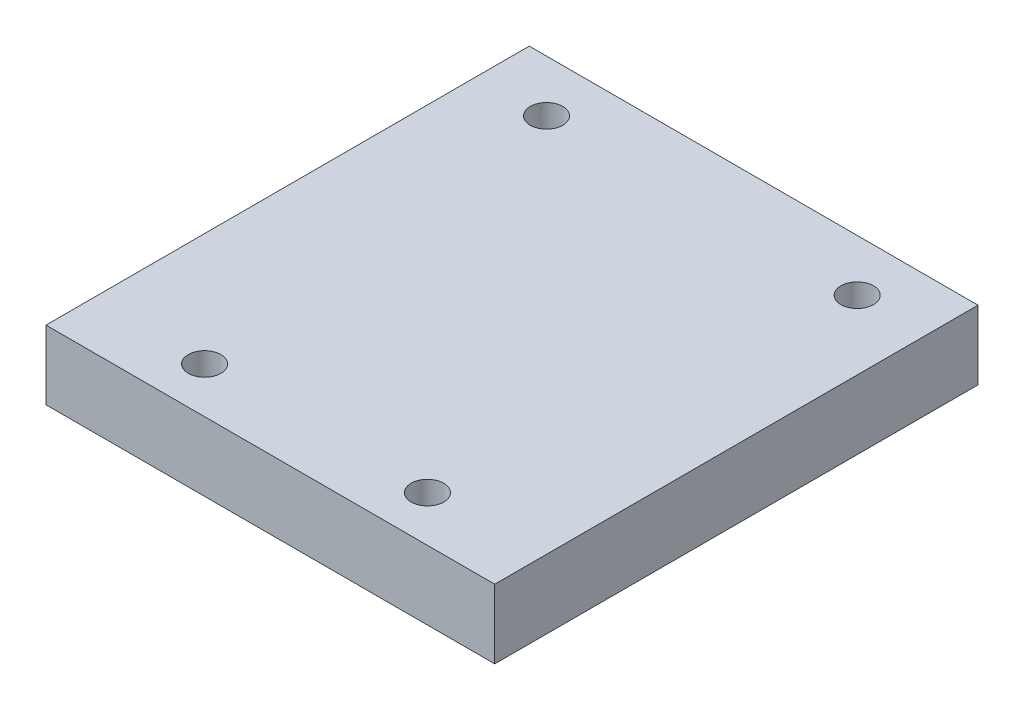
ISO-10303-21;
HEADER;
FILE_DESCRIPTION(('STEP AP214'),'2;1');
FILE_NAME('part.step','',(''),(''),'','','');
FILE_SCHEMA(('AUTOMOTIVE_DESIGN { 1 0 10303 214 1 1 1 1 }'));
ENDSEC;
DATA;
#1=APPLICATION_CONTEXT('core data for automotive mechanical design processes');
#2=APPLICATION_PROTOCOL_DEFINITION('international standard','automotive_design',2000,#1);
#3=PRODUCT_CONTEXT('',#1,'mechanical');
#4=PRODUCT('Part','Part','',(#3));
#5=PRODUCT_RELATED_PRODUCT_CATEGORY('part','',(#4));
#6=PRODUCT_DEFINITION_FORMATION('','',#4);
#7=PRODUCT_DEFINITION_CONTEXT('part definition',#1,'design');
#8=PRODUCT_DEFINITION('design','',#6,#7);
#9=PRODUCT_DEFINITION_SHAPE('','',#8);
#10=(LENGTH_UNIT() NAMED_UNIT(*) SI_UNIT(.MILLI.,.METRE.));
#11=(NAMED_UNIT(*) PLANE_ANGLE_UNIT() SI_UNIT($,.RADIAN.));
#12=(NAMED_UNIT(*) SI_UNIT($,.STERADIAN.) SOLID_ANGLE_UNIT());
#13=UNCERTAINTY_MEASURE_WITH_UNIT(LENGTH_MEASURE(1.E-05),#10,'distance_accuracy_value','');
#14=(GEOMETRIC_REPRESENTATION_CONTEXT(3) GLOBAL_UNCERTAINTY_ASSIGNED_CONTEXT((#13)) GLOBAL_UNIT_ASSIGNED_CONTEXT((#10,
#11,#12)) REPRESENTATION_CONTEXT('',''));
#15=CARTESIAN_POINT('',(0.,0.,0.));
#16=DIRECTION('',(0.,0.,1.));
#17=DIRECTION('',(1.,0.,0.));
#18=AXIS2_PLACEMENT_3D('',#15,#16,#17);
#19=CARTESIAN_POINT('',(0.,12.7,0.));
#20=DIRECTION('',(-1.,0.,0.));
#21=DIRECTION('',(0.,0.,1.));
#22=AXIS2_PLACEMENT_3D('',#19,#20,#21);
#23=PLANE('',#22);
#24=DIRECTION('',(0.,0.,-1.));
#25=VECTOR('',#24,1.);
#26=CARTESIAN_POINT('',(0.,0.,0.));
#27=LINE('',#26,#25);
#28=CARTESIAN_POINT('',(0.,0.,88.9));
#29=VERTEX_POINT('',#28);
#30=CARTESIAN_POINT('',(0.,0.,0.));
#31=VERTEX_POINT('',#30);
#32=EDGE_CURVE('E113',#29,#31,#27,.T.);
#33=ORIENTED_EDGE('',*,*,#32,.T.);
#34=DIRECTION('',(0.,-1.,0.));
#35=VECTOR('',#34,1.);
#36=CARTESIAN_POINT('',(0.,12.7,0.));
#37=LINE('',#36,#35);
#38=CARTESIAN_POINT('',(0.,12.7,0.));
#39=VERTEX_POINT('',#38);
#40=EDGE_CURVE('E11',#39,#31,#37,.T.);
#41=ORIENTED_EDGE('',*,*,#40,.F.);
#42=DIRECTION('',(0.,0.,-1.));
#43=VECTOR('',#42,1.);
#44=CARTESIAN_POINT('',(0.,12.7,0.));
#45=LINE('',#44,#43);
#46=CARTESIAN_POINT('',(0.,12.7,88.9));
#47=VERTEX_POINT('',#46);
#48=EDGE_CURVE('E97',#47,#39,#45,.T.);
#49=ORIENTED_EDGE('',*,*,#48,.F.);
#50=DIRECTION('',(0.,-1.,0.));
#51=VECTOR('',#50,1.);
#52=CARTESIAN_POINT('',(0.,12.7,88.9));
#53=LINE('',#52,#51);
#54=EDGE_CURVE('E109',#47,#29,#53,.T.);
#55=ORIENTED_EDGE('',*,*,#54,.T.);
#56=EDGE_LOOP('',(#33,#41,#49,#55));
#57=FACE_BOUND('',#56,.T.);
#58=ADVANCED_FACE('F45',(#57),#23,.F.);
#59=CARTESIAN_POINT('',(0.,12.7,0.));
#60=DIRECTION('',(0.,0.,1.));
#61=DIRECTION('',(1.,0.,0.));
#62=AXIS2_PLACEMENT_3D('',#59,#60,#61);
#63=PLANE('',#62);
#64=DIRECTION('',(-1.,0.,0.));
#65=VECTOR('',#64,1.);
#66=CARTESIAN_POINT('',(0.,0.,0.));
#67=LINE('',#66,#65);
#68=CARTESIAN_POINT('',(-82.55,0.,0.));
#69=VERTEX_POINT('',#68);
#70=EDGE_CURVE('E102',#31,#69,#67,.T.);
#71=ORIENTED_EDGE('',*,*,#70,.T.);
#72=DIRECTION('',(0.,-1.,0.));
#73=VECTOR('',#72,1.);
#74=CARTESIAN_POINT('',(-82.55,12.7,0.));
#75=LINE('',#74,#73);
#76=CARTESIAN_POINT('',(-82.55,12.7,0.));
#77=VERTEX_POINT('',#76);
#78=EDGE_CURVE('E54',#77,#69,#75,.T.);
#79=ORIENTED_EDGE('',*,*,#78,.F.);
#80=DIRECTION('',(-1.,0.,0.));
#81=VECTOR('',#80,1.);
#82=CARTESIAN_POINT('',(0.,12.7,0.));
#83=LINE('',#82,#81);
#84=EDGE_CURVE('E92',#39,#77,#83,.T.);
#85=ORIENTED_EDGE('',*,*,#84,.F.);
#86=ORIENTED_EDGE('',*,*,#40,.T.);
#87=EDGE_LOOP('',(#71,#79,#85,#86));
#88=FACE_BOUND('',#87,.T.);
#89=ADVANCED_FACE('F101',(#88),#63,.F.);
#90=CARTESIAN_POINT('',(-82.55,12.7,0.));
#91=DIRECTION('',(1.,0.,0.));
#92=DIRECTION('',(0.,0.,-1.));
#93=AXIS2_PLACEMENT_3D('',#90,#91,#92);
#94=PLANE('',#93);
#95=DIRECTION('',(0.,0.,1.));
#96=VECTOR('',#95,1.);
#97=CARTESIAN_POINT('',(-82.55,0.,0.));
#98=LINE('',#97,#96);
#99=CARTESIAN_POINT('',(-82.55,0.,88.9));
#100=VERTEX_POINT('',#99);
#101=EDGE_CURVE('E79',#69,#100,#98,.T.);
#102=ORIENTED_EDGE('',*,*,#101,.T.);
#103=DIRECTION('',(0.,-1.,0.));
#104=VECTOR('',#103,1.);
#105=CARTESIAN_POINT('',(-82.55,12.7,88.9));
#106=LINE('',#105,#104);
#107=CARTESIAN_POINT('',(-82.55,12.7,88.9));
#108=VERTEX_POINT('',#107);
#109=EDGE_CURVE('E104',#108,#100,#106,.T.);
#110=ORIENTED_EDGE('',*,*,#109,.F.);
#111=DIRECTION('',(0.,0.,1.));
#112=VECTOR('',#111,1.);
#113=CARTESIAN_POINT('',(-82.55,12.7,0.));
#114=LINE('',#113,#112);
#115=EDGE_CURVE('E95',#77,#108,#114,.T.);
#116=ORIENTED_EDGE('',*,*,#115,.F.);
#117=ORIENTED_EDGE('',*,*,#78,.T.);
#118=EDGE_LOOP('',(#102,#110,#116,#117));
#119=FACE_BOUND('',#118,.T.);
#120=ADVANCED_FACE('F105',(#119),#94,.F.);
#121=CARTESIAN_POINT('',(0.,12.7,88.9));
#122=DIRECTION('',(0.,0.,-1.));
#123=DIRECTION('',(-1.,0.,0.));
#124=AXIS2_PLACEMENT_3D('',#121,#122,#123);
#125=PLANE('',#124);
#126=DIRECTION('',(1.,0.,0.));
#127=VECTOR('',#126,1.);
#128=CARTESIAN_POINT('',(0.,0.,88.9));
#129=LINE('',#128,#127);
#130=EDGE_CURVE('E85',#100,#29,#129,.T.);
#131=ORIENTED_EDGE('',*,*,#130,.T.);
#132=ORIENTED_EDGE('',*,*,#54,.F.);
#133=DIRECTION('',(1.,0.,0.));
#134=VECTOR('',#133,1.);
#135=CARTESIAN_POINT('',(0.,12.7,88.9));
#136=LINE('',#135,#134);
#137=EDGE_CURVE('E62',#108,#47,#136,.T.);
#138=ORIENTED_EDGE('',*,*,#137,.F.);
#139=ORIENTED_EDGE('',*,*,#109,.T.);
#140=EDGE_LOOP('',(#131,#132,#138,#139));
#141=FACE_BOUND('',#140,.T.);
#142=ADVANCED_FACE('F127',(#141),#125,.F.);
#143=CARTESIAN_POINT('',(0.,12.7,0.));
#144=DIRECTION('',(0.,-1.,0.));
#145=DIRECTION('',(0.,0.,-1.));
#146=AXIS2_PLACEMENT_3D('',#143,#144,#145);
#147=PLANE('',#146);
#148=CARTESIAN_POINT('',(-69.85,12.7,9.525));
#149=DIRECTION('',(0.,1.,0.));
#150=DIRECTION('',(0.,0.,1.));
#151=AXIS2_PLACEMENT_3D('',#148,#149,#150);
#152=CIRCLE('',#151,3.00000000000001);
#153=CARTESIAN_POINT('',(-69.85,12.7,12.525));
#154=VERTEX_POINT('',#153);
#155=EDGE_CURVE('E151',#154,#154,#152,.T.);
#156=ORIENTED_EDGE('',*,*,#155,.F.);
#157=EDGE_LOOP('',(#156));
#158=FACE_BOUND('',#157,.T.);
#159=CARTESIAN_POINT('',(-20.775,12.7,80.5046504728644));
#160=DIRECTION('',(0.,1.,0.));
#161=DIRECTION('',(0.,0.,1.));
#162=AXIS2_PLACEMENT_3D('',#159,#160,#161);
#163=CIRCLE('',#162,3.);
#164=CARTESIAN_POINT('',(-20.775,12.7,83.5046504728644));
#165=VERTEX_POINT('',#164);
#166=EDGE_CURVE('E139',#165,#165,#163,.T.);
#167=ORIENTED_EDGE('',*,*,#166,.F.);
#168=EDGE_LOOP('',(#167));
#169=FACE_BOUND('',#168,.T.);
#170=CARTESIAN_POINT('',(-61.775,12.7,80.5046504728644));
#171=DIRECTION('',(0.,1.,0.));
#172=DIRECTION('',(0.,0.,1.));
#173=AXIS2_PLACEMENT_3D('',#170,#171,#172);
#174=CIRCLE('',#173,3.00000000000001);
#175=CARTESIAN_POINT('',(-61.775,12.7,83.5046504728644));
#176=VERTEX_POINT('',#175);
#177=EDGE_CURVE('E138',#176,#176,#174,.T.);
#178=ORIENTED_EDGE('',*,*,#177,.F.);
#179=EDGE_LOOP('',(#178));
#180=FACE_BOUND('',#179,.T.);
#181=CARTESIAN_POINT('',(-12.7,12.7,9.525));
#182=DIRECTION('',(0.,1.,0.));
#183=DIRECTION('',(0.,0.,1.));
#184=AXIS2_PLACEMENT_3D('',#181,#182,#183);
#185=CIRCLE('',#184,3.);
#186=CARTESIAN_POINT('',(-12.7,12.7,12.525));
#187=VERTEX_POINT('',#186);
#188=EDGE_CURVE('E147',#187,#187,#185,.T.);
#189=ORIENTED_EDGE('',*,*,#188,.F.);
#190=EDGE_LOOP('',(#189));
#191=FACE_BOUND('',#190,.T.);
#192=ORIENTED_EDGE('',*,*,#48,.T.);
#193=ORIENTED_EDGE('',*,*,#84,.T.);
#194=ORIENTED_EDGE('',*,*,#115,.T.);
#195=ORIENTED_EDGE('',*,*,#137,.T.);
#196=EDGE_LOOP('',(#192,#193,#194,#195));
#197=FACE_BOUND('',#196,.T.);
#198=ADVANCED_FACE('F93',(#158,#169,#180,#191,#197),#147,.F.);
#199=CARTESIAN_POINT('',(0.,0.,0.));
#200=DIRECTION('',(0.,-1.,0.));
#201=DIRECTION('',(0.,0.,-1.));
#202=AXIS2_PLACEMENT_3D('',#199,#200,#201);
#203=PLANE('',#202);
#204=CARTESIAN_POINT('',(-34.8,0.,57.15));
#205=DIRECTION('',(0.,-1.,0.));
#206=DIRECTION('',(0.,0.,-1.));
#207=AXIS2_PLACEMENT_3D('',#204,#205,#206);
#208=CIRCLE('',#207,2.75);
#209=CARTESIAN_POINT('',(-34.8,0.,54.4));
#210=VERTEX_POINT('',#209);
#211=EDGE_CURVE('E170',#210,#210,#208,.T.);
#212=ORIENTED_EDGE('',*,*,#211,.F.);
#213=EDGE_LOOP('',(#212));
#214=FACE_BOUND('',#213,.T.);
#215=CARTESIAN_POINT('',(-50.8,0.,41.15));
#216=DIRECTION('',(0.,-1.,0.));
#217=DIRECTION('',(0.,0.,-1.));
#218=AXIS2_PLACEMENT_3D('',#215,#216,#217);
#219=CIRCLE('',#218,2.75);
#220=CARTESIAN_POINT('',(-50.8,0.,38.4));
#221=VERTEX_POINT('',#220);
#222=EDGE_CURVE('E178',#221,#221,#219,.T.);
#223=ORIENTED_EDGE('',*,*,#222,.F.);
#224=EDGE_LOOP('',(#223));
#225=FACE_BOUND('',#224,.T.);
#226=CARTESIAN_POINT('',(-34.8,0.,41.15));
#227=DIRECTION('',(0.,-1.,0.));
#228=DIRECTION('',(0.,0.,-1.));
#229=AXIS2_PLACEMENT_3D('',#226,#227,#228);
#230=CIRCLE('',#229,2.75);
#231=CARTESIAN_POINT('',(-34.8,0.,38.4));
#232=VERTEX_POINT('',#231);
#233=EDGE_CURVE('E179',#232,#232,#230,.T.);
#234=ORIENTED_EDGE('',*,*,#233,.F.);
#235=EDGE_LOOP('',(#234));
#236=FACE_BOUND('',#235,.T.);
#237=CARTESIAN_POINT('',(-50.8,0.,57.15));
#238=DIRECTION('',(0.,-1.,0.));
#239=DIRECTION('',(0.,0.,-1.));
#240=AXIS2_PLACEMENT_3D('',#237,#238,#239);
#241=CIRCLE('',#240,2.75);
#242=CARTESIAN_POINT('',(-50.8,0.,54.4));
#243=VERTEX_POINT('',#242);
#244=EDGE_CURVE('E166',#243,#243,#241,.T.);
#245=ORIENTED_EDGE('',*,*,#244,.F.);
#246=EDGE_LOOP('',(#245));
#247=FACE_BOUND('',#246,.T.);
#248=ORIENTED_EDGE('',*,*,#32,.F.);
#249=ORIENTED_EDGE('',*,*,#130,.F.);
#250=ORIENTED_EDGE('',*,*,#101,.F.);
#251=ORIENTED_EDGE('',*,*,#70,.F.);
#252=EDGE_LOOP('',(#248,#249,#250,#251));
#253=FACE_BOUND('',#252,.T.);
#254=ADVANCED_FACE('F130',(#214,#225,#236,#247,#253),#203,.T.);
#255=CARTESIAN_POINT('',(-12.7,6.35,9.525));
#256=DIRECTION('',(0.,1.,0.));
#257=DIRECTION('',(0.,0.,1.));
#258=AXIS2_PLACEMENT_3D('',#255,#256,#257);
#259=CYLINDRICAL_SURFACE('',#258,3.);
#260=CARTESIAN_POINT('',(-12.7,6.35,9.525));
#261=DIRECTION('',(0.,1.,0.));
#262=DIRECTION('',(0.,0.,1.));
#263=AXIS2_PLACEMENT_3D('',#260,#261,#262);
#264=CIRCLE('',#263,3.);
#265=CARTESIAN_POINT('',(-12.7,6.35,12.525));
#266=VERTEX_POINT('',#265);
#267=EDGE_CURVE('E143',#266,#266,#264,.T.);
#268=ORIENTED_EDGE('',*,*,#267,.F.);
#269=EDGE_LOOP('',(#268));
#270=FACE_BOUND('',#269,.T.);
#271=ORIENTED_EDGE('',*,*,#188,.T.);
#272=EDGE_LOOP('',(#271));
#273=FACE_BOUND('',#272,.T.);
#274=ADVANCED_FACE('F202',(#270,#273),#259,.F.);
#275=CARTESIAN_POINT('',(-12.7,6.35,9.525));
#276=DIRECTION('',(0.,1.,0.));
#277=DIRECTION('',(0.,0.,1.));
#278=AXIS2_PLACEMENT_3D('',#275,#276,#277);
#279=PLANE('',#278);
#280=ORIENTED_EDGE('',*,*,#267,.T.);
#281=EDGE_LOOP('',(#280));
#282=FACE_BOUND('',#281,.T.);
#283=ADVANCED_FACE('F245',(#282),#279,.T.);
#284=CARTESIAN_POINT('',(-61.775,6.35,80.5046504728644));
#285=DIRECTION('',(0.,1.,0.));
#286=DIRECTION('',(0.,0.,1.));
#287=AXIS2_PLACEMENT_3D('',#284,#285,#286);
#288=CYLINDRICAL_SURFACE('',#287,3.00000000000001);
#289=CARTESIAN_POINT('',(-61.775,6.35,80.5046504728644));
#290=DIRECTION('',(0.,1.,0.));
#291=DIRECTION('',(0.,0.,1.));
#292=AXIS2_PLACEMENT_3D('',#289,#290,#291);
#293=CIRCLE('',#292,3.00000000000001);
#294=CARTESIAN_POINT('',(-61.775,6.35,83.5046504728644));
#295=VERTEX_POINT('',#294);
#296=EDGE_CURVE('E134',#295,#295,#293,.T.);
#297=ORIENTED_EDGE('',*,*,#296,.F.);
#298=EDGE_LOOP('',(#297));
#299=FACE_BOUND('',#298,.T.);
#300=ORIENTED_EDGE('',*,*,#177,.T.);
#301=EDGE_LOOP('',(#300));
#302=FACE_BOUND('',#301,.T.);
#303=ADVANCED_FACE('F241',(#299,#302),#288,.F.);
#304=CARTESIAN_POINT('',(-61.775,6.35,80.5046504728644));
#305=DIRECTION('',(0.,1.,0.));
#306=DIRECTION('',(0.,0.,1.));
#307=AXIS2_PLACEMENT_3D('',#304,#305,#306);
#308=PLANE('',#307);
#309=ORIENTED_EDGE('',*,*,#296,.T.);
#310=EDGE_LOOP('',(#309));
#311=FACE_BOUND('',#310,.T.);
#312=ADVANCED_FACE('F237',(#311),#308,.T.);
#313=CARTESIAN_POINT('',(-20.775,6.35,80.5046504728644));
#314=DIRECTION('',(0.,1.,0.));
#315=DIRECTION('',(0.,0.,1.));
#316=AXIS2_PLACEMENT_3D('',#313,#314,#315);
#317=CYLINDRICAL_SURFACE('',#316,3.);
#318=CARTESIAN_POINT('',(-20.775,6.35,80.5046504728644));
#319=DIRECTION('',(0.,1.,0.));
#320=DIRECTION('',(0.,0.,1.));
#321=AXIS2_PLACEMENT_3D('',#318,#319,#320);
#322=CIRCLE('',#321,3.);
#323=CARTESIAN_POINT('',(-20.775,6.35,83.5046504728644));
#324=VERTEX_POINT('',#323);
#325=EDGE_CURVE('E152',#324,#324,#322,.T.);
#326=ORIENTED_EDGE('',*,*,#325,.F.);
#327=EDGE_LOOP('',(#326));
#328=FACE_BOUND('',#327,.T.);
#329=ORIENTED_EDGE('',*,*,#166,.T.);
#330=EDGE_LOOP('',(#329));
#331=FACE_BOUND('',#330,.T.);
#332=ADVANCED_FACE('F240',(#328,#331),#317,.F.);
#333=CARTESIAN_POINT('',(-20.775,6.35,80.5046504728644));
#334=DIRECTION('',(0.,1.,0.));
#335=DIRECTION('',(0.,0.,1.));
#336=AXIS2_PLACEMENT_3D('',#333,#334,#335);
#337=PLANE('',#336);
#338=ORIENTED_EDGE('',*,*,#325,.T.);
#339=EDGE_LOOP('',(#338));
#340=FACE_BOUND('',#339,.T.);
#341=ADVANCED_FACE('F253',(#340),#337,.T.);
#342=CARTESIAN_POINT('',(-69.85,6.35,9.525));
#343=DIRECTION('',(0.,1.,0.));
#344=DIRECTION('',(0.,0.,1.));
#345=AXIS2_PLACEMENT_3D('',#342,#343,#344);
#346=CYLINDRICAL_SURFACE('',#345,3.00000000000001);
#347=CARTESIAN_POINT('',(-69.85,6.35,9.525));
#348=DIRECTION('',(0.,1.,0.));
#349=DIRECTION('',(0.,0.,1.));
#350=AXIS2_PLACEMENT_3D('',#347,#348,#349);
#351=CIRCLE('',#350,3.00000000000001);
#352=CARTESIAN_POINT('',(-69.85,6.35,12.525));
#353=VERTEX_POINT('',#352);
#354=EDGE_CURVE('E117',#353,#353,#351,.T.);
#355=ORIENTED_EDGE('',*,*,#354,.F.);
#356=EDGE_LOOP('',(#355));
#357=FACE_BOUND('',#356,.T.);
#358=ORIENTED_EDGE('',*,*,#155,.T.);
#359=EDGE_LOOP('',(#358));
#360=FACE_BOUND('',#359,.T.);
#361=ADVANCED_FACE('F219',(#357,#360),#346,.F.);
#362=CARTESIAN_POINT('',(-69.85,6.35,9.525));
#363=DIRECTION('',(0.,1.,0.));
#364=DIRECTION('',(0.,0.,1.));
#365=AXIS2_PLACEMENT_3D('',#362,#363,#364);
#366=PLANE('',#365);
#367=ORIENTED_EDGE('',*,*,#354,.T.);
#368=EDGE_LOOP('',(#367));
#369=FACE_BOUND('',#368,.T.);
#370=ADVANCED_FACE('F210',(#369),#366,.T.);
#371=CARTESIAN_POINT('',(-50.8,6.35,57.15));
#372=DIRECTION('',(0.,-1.,0.));
#373=DIRECTION('',(0.,0.,-1.));
#374=AXIS2_PLACEMENT_3D('',#371,#372,#373);
#375=CYLINDRICAL_SURFACE('',#374,2.75);
#376=CARTESIAN_POINT('',(-50.8,6.35,57.15));
#377=DIRECTION('',(0.,-1.,0.));
#378=DIRECTION('',(0.,0.,-1.));
#379=AXIS2_PLACEMENT_3D('',#376,#377,#378);
#380=CIRCLE('',#379,2.75);
#381=CARTESIAN_POINT('',(-50.8,6.35,54.4));
#382=VERTEX_POINT('',#381);
#383=EDGE_CURVE('E156',#382,#382,#380,.T.);
#384=ORIENTED_EDGE('',*,*,#383,.F.);
#385=EDGE_LOOP('',(#384));
#386=FACE_BOUND('',#385,.T.);
#387=ORIENTED_EDGE('',*,*,#244,.T.);
#388=EDGE_LOOP('',(#387));
#389=FACE_BOUND('',#388,.T.);
#390=ADVANCED_FACE('F207',(#386,#389),#375,.F.);
#391=CARTESIAN_POINT('',(-50.8,6.35,57.15));
#392=DIRECTION('',(0.,-1.,0.));
#393=DIRECTION('',(0.,0.,-1.));
#394=AXIS2_PLACEMENT_3D('',#391,#392,#393);
#395=PLANE('',#394);
#396=ORIENTED_EDGE('',*,*,#383,.T.);
#397=EDGE_LOOP('',(#396));
#398=FACE_BOUND('',#397,.T.);
#399=ADVANCED_FACE('F209',(#398),#395,.T.);
#400=CARTESIAN_POINT('',(-34.8,6.35,41.15));
#401=DIRECTION('',(0.,-1.,0.));
#402=DIRECTION('',(0.,0.,-1.));
#403=AXIS2_PLACEMENT_3D('',#400,#401,#402);
#404=CYLINDRICAL_SURFACE('',#403,2.75);
#405=CARTESIAN_POINT('',(-34.8,6.35,41.15));
#406=DIRECTION('',(0.,-1.,0.));
#407=DIRECTION('',(0.,0.,-1.));
#408=AXIS2_PLACEMENT_3D('',#405,#406,#407);
#409=CIRCLE('',#408,2.75);
#410=CARTESIAN_POINT('',(-34.8,6.35,38.4));
#411=VERTEX_POINT('',#410);
#412=EDGE_CURVE('E190',#411,#411,#409,.T.);
#413=ORIENTED_EDGE('',*,*,#412,.F.);
#414=EDGE_LOOP('',(#413));
#415=FACE_BOUND('',#414,.T.);
#416=ORIENTED_EDGE('',*,*,#233,.T.);
#417=EDGE_LOOP('',(#416));
#418=FACE_BOUND('',#417,.T.);
#419=ADVANCED_FACE('F198',(#415,#418),#404,.F.);
#420=CARTESIAN_POINT('',(-34.8,6.35,41.15));
#421=DIRECTION('',(0.,-1.,0.));
#422=DIRECTION('',(0.,0.,-1.));
#423=AXIS2_PLACEMENT_3D('',#420,#421,#422);
#424=PLANE('',#423);
#425=ORIENTED_EDGE('',*,*,#412,.T.);
#426=EDGE_LOOP('',(#425));
#427=FACE_BOUND('',#426,.T.);
#428=ADVANCED_FACE('F347',(#427),#424,.T.);
#429=CARTESIAN_POINT('',(-50.8,6.35,41.15));
#430=DIRECTION('',(0.,-1.,0.));
#431=DIRECTION('',(0.,0.,-1.));
#432=AXIS2_PLACEMENT_3D('',#429,#430,#431);
#433=CYLINDRICAL_SURFACE('',#432,2.75);
#434=CARTESIAN_POINT('',(-50.8,6.35,41.15));
#435=DIRECTION('',(0.,-1.,0.));
#436=DIRECTION('',(0.,0.,-1.));
#437=AXIS2_PLACEMENT_3D('',#434,#435,#436);
#438=CIRCLE('',#437,2.75);
#439=CARTESIAN_POINT('',(-50.8,6.35,38.4));
#440=VERTEX_POINT('',#439);
#441=EDGE_CURVE('E174',#440,#440,#438,.T.);
#442=ORIENTED_EDGE('',*,*,#441,.F.);
#443=EDGE_LOOP('',(#442));
#444=FACE_BOUND('',#443,.T.);
#445=ORIENTED_EDGE('',*,*,#222,.T.);
#446=EDGE_LOOP('',(#445));
#447=FACE_BOUND('',#446,.T.);
#448=ADVANCED_FACE('F356',(#444,#447),#433,.F.);
#449=CARTESIAN_POINT('',(-50.8,6.35,41.15));
#450=DIRECTION('',(0.,-1.,0.));
#451=DIRECTION('',(0.,0.,-1.));
#452=AXIS2_PLACEMENT_3D('',#449,#450,#451);
#453=PLANE('',#452);
#454=ORIENTED_EDGE('',*,*,#441,.T.);
#455=EDGE_LOOP('',(#454));
#456=FACE_BOUND('',#455,.T.);
#457=ADVANCED_FACE('F365',(#456),#453,.T.);
#458=CARTESIAN_POINT('',(-34.8,6.35,57.15));
#459=DIRECTION('',(0.,-1.,0.));
#460=DIRECTION('',(0.,0.,-1.));
#461=AXIS2_PLACEMENT_3D('',#458,#459,#460);
#462=CYLINDRICAL_SURFACE('',#461,2.75);
#463=CARTESIAN_POINT('',(-34.8,6.35,57.15));
#464=DIRECTION('',(0.,-1.,0.));
#465=DIRECTION('',(0.,0.,-1.));
#466=AXIS2_PLACEMENT_3D('',#463,#464,#465);
#467=CIRCLE('',#466,2.75);
#468=CARTESIAN_POINT('',(-34.8,6.35,54.4));
#469=VERTEX_POINT('',#468);
#470=EDGE_CURVE('E183',#469,#469,#467,.T.);
#471=ORIENTED_EDGE('',*,*,#470,.F.);
#472=EDGE_LOOP('',(#471));
#473=FACE_BOUND('',#472,.T.);
#474=ORIENTED_EDGE('',*,*,#211,.T.);
#475=EDGE_LOOP('',(#474));
#476=FACE_BOUND('',#475,.T.);
#477=ADVANCED_FACE('F374',(#473,#476),#462,.F.);
#478=CARTESIAN_POINT('',(-34.8,6.35,57.15));
#479=DIRECTION('',(0.,-1.,0.));
#480=DIRECTION('',(0.,0.,-1.));
#481=AXIS2_PLACEMENT_3D('',#478,#479,#480);
#482=PLANE('',#481);
#483=ORIENTED_EDGE('',*,*,#470,.T.);
#484=EDGE_LOOP('',(#483));
#485=FACE_BOUND('',#484,.T.);
#486=ADVANCED_FACE('F383',(#485),#482,.T.);
#487=CLOSED_SHELL('',(#58,#89,#120,#142,#198,#254,#274,#283,#303,#312,#332,#341,#361,#370,#390,
#399,#419,#428,#448,#457,#477,#486));
#488=MANIFOLD_SOLID_BREP('B2',#487);
#489=ADVANCED_BREP_SHAPE_REPRESENTATION('',(#18,#488),#14);
#490=SHAPE_DEFINITION_REPRESENTATION(#9,#489);
ENDSEC;
END-ISO-10303-21;
